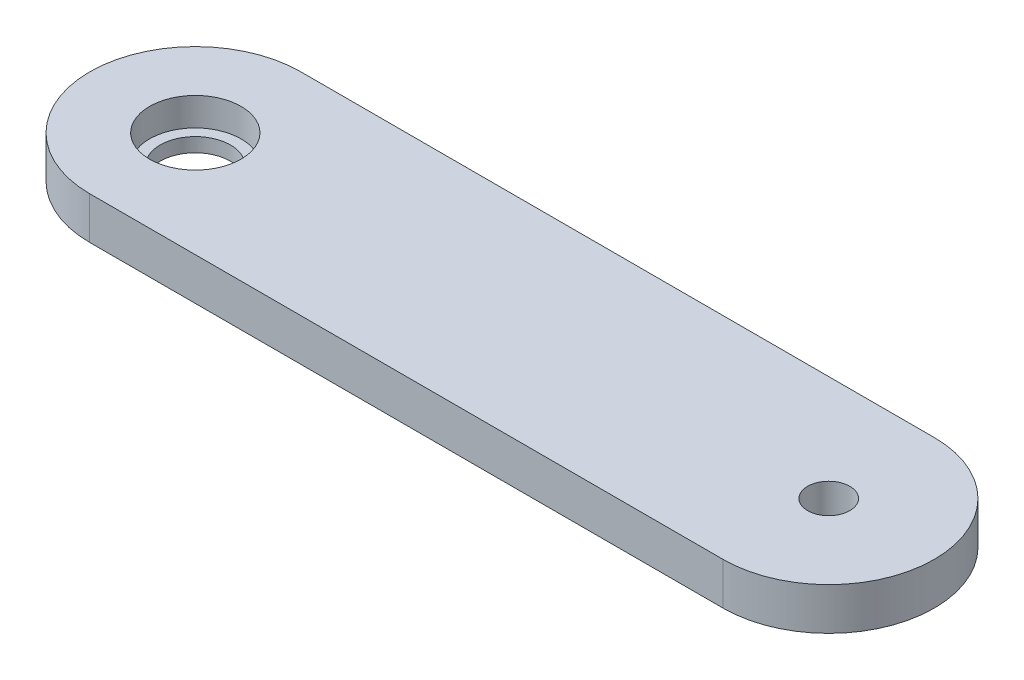
ISO-10303-21;
HEADER;
FILE_DESCRIPTION(('STEP AP214'),'2;1');
FILE_NAME('part.step','',(''),(''),'','','');
FILE_SCHEMA(('AUTOMOTIVE_DESIGN { 1 0 10303 214 1 1 1 1 }'));
ENDSEC;
DATA;
#1=APPLICATION_CONTEXT('core data for automotive mechanical design processes');
#2=APPLICATION_PROTOCOL_DEFINITION('international standard','automotive_design',2000,#1);
#3=PRODUCT_CONTEXT('',#1,'mechanical');
#4=PRODUCT('Part','Part','',(#3));
#5=PRODUCT_RELATED_PRODUCT_CATEGORY('part','',(#4));
#6=PRODUCT_DEFINITION_FORMATION('','',#4);
#7=PRODUCT_DEFINITION_CONTEXT('part definition',#1,'design');
#8=PRODUCT_DEFINITION('design','',#6,#7);
#9=PRODUCT_DEFINITION_SHAPE('','',#8);
#10=(LENGTH_UNIT() NAMED_UNIT(*) SI_UNIT(.MILLI.,.METRE.));
#11=(NAMED_UNIT(*) PLANE_ANGLE_UNIT() SI_UNIT($,.RADIAN.));
#12=(NAMED_UNIT(*) SI_UNIT($,.STERADIAN.) SOLID_ANGLE_UNIT());
#13=UNCERTAINTY_MEASURE_WITH_UNIT(LENGTH_MEASURE(1.E-05),#10,'distance_accuracy_value','');
#14=(GEOMETRIC_REPRESENTATION_CONTEXT(3) GLOBAL_UNCERTAINTY_ASSIGNED_CONTEXT((#13)) GLOBAL_UNIT_ASSIGNED_CONTEXT((#10,
#11,#12)) REPRESENTATION_CONTEXT('',''));
#15=CARTESIAN_POINT('',(0.,0.,0.));
#16=DIRECTION('',(0.,0.,1.));
#17=DIRECTION('',(1.,0.,0.));
#18=AXIS2_PLACEMENT_3D('',#15,#16,#17);
#19=CARTESIAN_POINT('',(-45.,6.,0.));
#20=DIRECTION('',(0.,-1.,0.));
#21=DIRECTION('',(0.,0.,-1.));
#22=AXIS2_PLACEMENT_3D('',#19,#20,#21);
#23=CYLINDRICAL_SURFACE('',#22,5.);
#24=CARTESIAN_POINT('',(-45.,0.,0.));
#25=DIRECTION('',(0.,1.,0.));
#26=DIRECTION('',(0.,0.,1.));
#27=AXIS2_PLACEMENT_3D('',#24,#25,#26);
#28=CIRCLE('',#27,5.);
#29=CARTESIAN_POINT('',(-45.,0.,5.));
#30=VERTEX_POINT('',#29);
#31=EDGE_CURVE('E115',#30,#30,#28,.T.);
#32=ORIENTED_EDGE('',*,*,#31,.F.);
#33=EDGE_LOOP('',(#32));
#34=FACE_BOUND('',#33,.T.);
#35=CARTESIAN_POINT('',(-45.,2.,0.));
#36=DIRECTION('',(0.,1.,0.));
#37=DIRECTION('',(0.,0.,1.));
#38=AXIS2_PLACEMENT_3D('',#35,#36,#37);
#39=CIRCLE('',#38,5.);
#40=CARTESIAN_POINT('',(-45.,2.,5.));
#41=VERTEX_POINT('',#40);
#42=EDGE_CURVE('E43',#41,#41,#39,.T.);
#43=ORIENTED_EDGE('',*,*,#42,.T.);
#44=EDGE_LOOP('',(#43));
#45=FACE_BOUND('',#44,.T.);
#46=ADVANCED_FACE('F39',(#34,#45),#23,.F.);
#47=CARTESIAN_POINT('',(45.,6.,0.));
#48=DIRECTION('',(0.,1.,0.));
#49=DIRECTION('',(0.,0.,1.));
#50=AXIS2_PLACEMENT_3D('',#47,#48,#49);
#51=PLANE('',#50);
#52=CARTESIAN_POINT('',(-45.,6.,0.));
#53=DIRECTION('',(0.,1.,0.));
#54=DIRECTION('',(0.,0.,1.));
#55=AXIS2_PLACEMENT_3D('',#52,#53,#54);
#56=CIRCLE('',#55,6.5);
#57=CARTESIAN_POINT('',(-45.,6.,6.5));
#58=VERTEX_POINT('',#57);
#59=EDGE_CURVE('E144',#58,#58,#56,.T.);
#60=ORIENTED_EDGE('',*,*,#59,.F.);
#61=EDGE_LOOP('',(#60));
#62=FACE_BOUND('',#61,.T.);
#63=CARTESIAN_POINT('',(45.,6.,0.));
#64=DIRECTION('',(0.,1.,0.));
#65=DIRECTION('',(0.,0.,1.));
#66=AXIS2_PLACEMENT_3D('',#63,#64,#65);
#67=CIRCLE('',#66,15.);
#68=CARTESIAN_POINT('',(45.,6.,15.));
#69=VERTEX_POINT('',#68);
#70=CARTESIAN_POINT('',(45.,6.,-15.));
#71=VERTEX_POINT('',#70);
#72=EDGE_CURVE('E94',#69,#71,#67,.T.);
#73=ORIENTED_EDGE('',*,*,#72,.T.);
#74=DIRECTION('',(-1.,0.,0.));
#75=VECTOR('',#74,1.);
#76=CARTESIAN_POINT('',(-45.,6.,-15.));
#77=LINE('',#76,#75);
#78=CARTESIAN_POINT('',(-45.,6.,-15.));
#79=VERTEX_POINT('',#78);
#80=EDGE_CURVE('E88',#71,#79,#77,.T.);
#81=ORIENTED_EDGE('',*,*,#80,.T.);
#82=CARTESIAN_POINT('',(-45.,6.,0.));
#83=DIRECTION('',(0.,1.,0.));
#84=DIRECTION('',(0.,0.,1.));
#85=AXIS2_PLACEMENT_3D('',#82,#83,#84);
#86=CIRCLE('',#85,15.);
#87=CARTESIAN_POINT('',(-45.,6.,15.));
#88=VERTEX_POINT('',#87);
#89=EDGE_CURVE('E92',#79,#88,#86,.T.);
#90=ORIENTED_EDGE('',*,*,#89,.T.);
#91=DIRECTION('',(1.,0.,0.));
#92=VECTOR('',#91,1.);
#93=CARTESIAN_POINT('',(-45.,6.,15.));
#94=LINE('',#93,#92);
#95=EDGE_CURVE('E58',#88,#69,#94,.T.);
#96=ORIENTED_EDGE('',*,*,#95,.T.);
#97=EDGE_LOOP('',(#73,#81,#90,#96));
#98=FACE_BOUND('',#97,.T.);
#99=CARTESIAN_POINT('',(45.,6.,0.));
#100=DIRECTION('',(0.,1.,0.));
#101=DIRECTION('',(0.,0.,1.));
#102=AXIS2_PLACEMENT_3D('',#99,#100,#101);
#103=CIRCLE('',#102,3.);
#104=CARTESIAN_POINT('',(45.,6.,3.));
#105=VERTEX_POINT('',#104);
#106=EDGE_CURVE('E136',#105,#105,#103,.T.);
#107=ORIENTED_EDGE('',*,*,#106,.F.);
#108=EDGE_LOOP('',(#107));
#109=FACE_BOUND('',#108,.T.);
#110=ADVANCED_FACE('F89',(#62,#98,#109),#51,.T.);
#111=CARTESIAN_POINT('',(45.,0.,0.));
#112=DIRECTION('',(0.,1.,0.));
#113=DIRECTION('',(0.,0.,1.));
#114=AXIS2_PLACEMENT_3D('',#111,#112,#113);
#115=PLANE('',#114);
#116=CARTESIAN_POINT('',(45.,0.,0.));
#117=DIRECTION('',(0.,1.,0.));
#118=DIRECTION('',(0.,0.,1.));
#119=AXIS2_PLACEMENT_3D('',#116,#117,#118);
#120=CIRCLE('',#119,15.);
#121=CARTESIAN_POINT('',(45.,0.,15.));
#122=VERTEX_POINT('',#121);
#123=CARTESIAN_POINT('',(45.,0.,-15.));
#124=VERTEX_POINT('',#123);
#125=EDGE_CURVE('E111',#122,#124,#120,.T.);
#126=ORIENTED_EDGE('',*,*,#125,.F.);
#127=DIRECTION('',(1.,0.,0.));
#128=VECTOR('',#127,1.);
#129=CARTESIAN_POINT('',(-45.,0.,15.));
#130=LINE('',#129,#128);
#131=CARTESIAN_POINT('',(-45.,0.,15.));
#132=VERTEX_POINT('',#131);
#133=EDGE_CURVE('E81',#132,#122,#130,.T.);
#134=ORIENTED_EDGE('',*,*,#133,.F.);
#135=CARTESIAN_POINT('',(-45.,0.,0.));
#136=DIRECTION('',(0.,1.,0.));
#137=DIRECTION('',(0.,0.,1.));
#138=AXIS2_PLACEMENT_3D('',#135,#136,#137);
#139=CIRCLE('',#138,15.);
#140=CARTESIAN_POINT('',(-45.,0.,-15.));
#141=VERTEX_POINT('',#140);
#142=EDGE_CURVE('E75',#141,#132,#139,.T.);
#143=ORIENTED_EDGE('',*,*,#142,.F.);
#144=DIRECTION('',(-1.,0.,0.));
#145=VECTOR('',#144,1.);
#146=CARTESIAN_POINT('',(-45.,0.,-15.));
#147=LINE('',#146,#145);
#148=EDGE_CURVE('E99',#124,#141,#147,.T.);
#149=ORIENTED_EDGE('',*,*,#148,.F.);
#150=EDGE_LOOP('',(#126,#134,#143,#149));
#151=FACE_BOUND('',#150,.T.);
#152=ORIENTED_EDGE('',*,*,#31,.T.);
#153=EDGE_LOOP('',(#152));
#154=FACE_BOUND('',#153,.T.);
#155=CARTESIAN_POINT('',(45.,0.,0.));
#156=DIRECTION('',(0.,1.,0.));
#157=DIRECTION('',(0.,0.,1.));
#158=AXIS2_PLACEMENT_3D('',#155,#156,#157);
#159=CIRCLE('',#158,3.);
#160=CARTESIAN_POINT('',(45.,0.,3.));
#161=VERTEX_POINT('',#160);
#162=EDGE_CURVE('E137',#161,#161,#159,.T.);
#163=ORIENTED_EDGE('',*,*,#162,.T.);
#164=EDGE_LOOP('',(#163));
#165=FACE_BOUND('',#164,.T.);
#166=ADVANCED_FACE('F128',(#151,#154,#165),#115,.F.);
#167=CARTESIAN_POINT('',(45.,6.,0.));
#168=DIRECTION('',(0.,-1.,0.));
#169=DIRECTION('',(0.,0.,-1.));
#170=AXIS2_PLACEMENT_3D('',#167,#168,#169);
#171=CYLINDRICAL_SURFACE('',#170,15.);
#172=ORIENTED_EDGE('',*,*,#125,.T.);
#173=DIRECTION('',(0.,-1.,0.));
#174=VECTOR('',#173,1.);
#175=CARTESIAN_POINT('',(45.,6.,-15.));
#176=LINE('',#175,#174);
#177=EDGE_CURVE('E11',#71,#124,#176,.T.);
#178=ORIENTED_EDGE('',*,*,#177,.F.);
#179=ORIENTED_EDGE('',*,*,#72,.F.);
#180=DIRECTION('',(0.,-1.,0.));
#181=VECTOR('',#180,1.);
#182=CARTESIAN_POINT('',(45.,6.,15.));
#183=LINE('',#182,#181);
#184=EDGE_CURVE('E107',#69,#122,#183,.T.);
#185=ORIENTED_EDGE('',*,*,#184,.T.);
#186=EDGE_LOOP('',(#172,#178,#179,#185));
#187=FACE_BOUND('',#186,.T.);
#188=ADVANCED_FACE('F41',(#187),#171,.T.);
#189=CARTESIAN_POINT('',(-45.,6.,-15.));
#190=DIRECTION('',(0.,0.,1.));
#191=DIRECTION('',(1.,0.,0.));
#192=AXIS2_PLACEMENT_3D('',#189,#190,#191);
#193=PLANE('',#192);
#194=ORIENTED_EDGE('',*,*,#148,.T.);
#195=DIRECTION('',(0.,-1.,0.));
#196=VECTOR('',#195,1.);
#197=CARTESIAN_POINT('',(-45.,6.,-15.));
#198=LINE('',#197,#196);
#199=EDGE_CURVE('E50',#79,#141,#198,.T.);
#200=ORIENTED_EDGE('',*,*,#199,.F.);
#201=ORIENTED_EDGE('',*,*,#80,.F.);
#202=ORIENTED_EDGE('',*,*,#177,.T.);
#203=EDGE_LOOP('',(#194,#200,#201,#202));
#204=FACE_BOUND('',#203,.T.);
#205=ADVANCED_FACE('F98',(#204),#193,.F.);
#206=CARTESIAN_POINT('',(-45.,6.,0.));
#207=DIRECTION('',(0.,-1.,0.));
#208=DIRECTION('',(0.,0.,-1.));
#209=AXIS2_PLACEMENT_3D('',#206,#207,#208);
#210=CYLINDRICAL_SURFACE('',#209,15.);
#211=ORIENTED_EDGE('',*,*,#142,.T.);
#212=DIRECTION('',(0.,-1.,0.));
#213=VECTOR('',#212,1.);
#214=CARTESIAN_POINT('',(-45.,6.,15.));
#215=LINE('',#214,#213);
#216=EDGE_CURVE('E101',#88,#132,#215,.T.);
#217=ORIENTED_EDGE('',*,*,#216,.F.);
#218=ORIENTED_EDGE('',*,*,#89,.F.);
#219=ORIENTED_EDGE('',*,*,#199,.T.);
#220=EDGE_LOOP('',(#211,#217,#218,#219));
#221=FACE_BOUND('',#220,.T.);
#222=ADVANCED_FACE('F103',(#221),#210,.T.);
#223=CARTESIAN_POINT('',(-45.,6.,15.));
#224=DIRECTION('',(0.,0.,-1.));
#225=DIRECTION('',(-1.,0.,0.));
#226=AXIS2_PLACEMENT_3D('',#223,#224,#225);
#227=PLANE('',#226);
#228=ORIENTED_EDGE('',*,*,#133,.T.);
#229=ORIENTED_EDGE('',*,*,#184,.F.);
#230=ORIENTED_EDGE('',*,*,#95,.F.);
#231=ORIENTED_EDGE('',*,*,#216,.T.);
#232=EDGE_LOOP('',(#228,#229,#230,#231));
#233=FACE_BOUND('',#232,.T.);
#234=ADVANCED_FACE('F125',(#233),#227,.F.);
#235=CARTESIAN_POINT('',(45.,6.,0.));
#236=DIRECTION('',(0.,-1.,0.));
#237=DIRECTION('',(0.,0.,-1.));
#238=AXIS2_PLACEMENT_3D('',#235,#236,#237);
#239=CYLINDRICAL_SURFACE('',#238,3.);
#240=ORIENTED_EDGE('',*,*,#106,.T.);
#241=EDGE_LOOP('',(#240));
#242=FACE_BOUND('',#241,.T.);
#243=ORIENTED_EDGE('',*,*,#162,.F.);
#244=EDGE_LOOP('',(#243));
#245=FACE_BOUND('',#244,.T.);
#246=ADVANCED_FACE('F165',(#242,#245),#239,.F.);
#247=CARTESIAN_POINT('',(-45.,2.,0.));
#248=DIRECTION('',(0.,1.,0.));
#249=DIRECTION('',(0.,0.,1.));
#250=AXIS2_PLACEMENT_3D('',#247,#248,#249);
#251=CYLINDRICAL_SURFACE('',#250,6.5);
#252=CARTESIAN_POINT('',(-45.,2.,0.));
#253=DIRECTION('',(0.,1.,0.));
#254=DIRECTION('',(0.,0.,1.));
#255=AXIS2_PLACEMENT_3D('',#252,#253,#254);
#256=CIRCLE('',#255,6.5);
#257=CARTESIAN_POINT('',(-45.,2.,6.5));
#258=VERTEX_POINT('',#257);
#259=EDGE_CURVE('E148',#258,#258,#256,.T.);
#260=ORIENTED_EDGE('',*,*,#259,.F.);
#261=EDGE_LOOP('',(#260));
#262=FACE_BOUND('',#261,.T.);
#263=ORIENTED_EDGE('',*,*,#59,.T.);
#264=EDGE_LOOP('',(#263));
#265=FACE_BOUND('',#264,.T.);
#266=ADVANCED_FACE('F160',(#262,#265),#251,.F.);
#267=CARTESIAN_POINT('',(-45.,2.,0.));
#268=DIRECTION('',(0.,1.,0.));
#269=DIRECTION('',(0.,0.,1.));
#270=AXIS2_PLACEMENT_3D('',#267,#268,#269);
#271=PLANE('',#270);
#272=ORIENTED_EDGE('',*,*,#42,.F.);
#273=EDGE_LOOP('',(#272));
#274=FACE_BOUND('',#273,.T.);
#275=ORIENTED_EDGE('',*,*,#259,.T.);
#276=EDGE_LOOP('',(#275));
#277=FACE_BOUND('',#276,.T.);
#278=ADVANCED_FACE('F158',(#274,#277),#271,.T.);
#279=CLOSED_SHELL('',(#46,#110,#166,#188,#205,#222,#234,#246,#266,#278));
#280=MANIFOLD_SOLID_BREP('B2',#279);
#281=ADVANCED_BREP_SHAPE_REPRESENTATION('',(#18,#280),#14);
#282=SHAPE_DEFINITION_REPRESENTATION(#9,#281);
ENDSEC;
END-ISO-10303-21;
